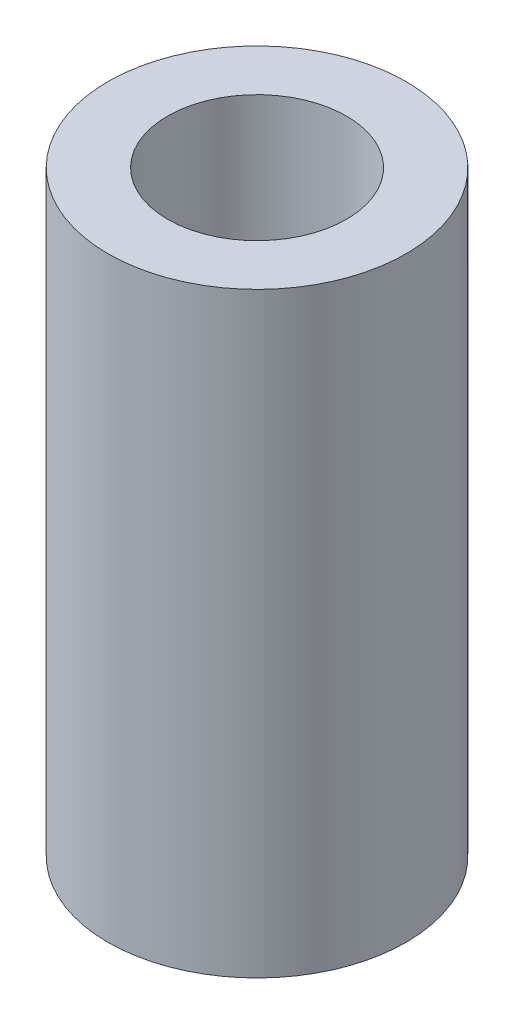
ISO-10303-21;
HEADER;
FILE_DESCRIPTION(('STEP AP214'),'2;1');
FILE_NAME('part.step','',(''),(''),'','','');
FILE_SCHEMA(('AUTOMOTIVE_DESIGN { 1 0 10303 214 1 1 1 1 }'));
ENDSEC;
DATA;
#1=APPLICATION_CONTEXT('core data for automotive mechanical design processes');
#2=APPLICATION_PROTOCOL_DEFINITION('international standard','automotive_design',2000,#1);
#3=PRODUCT_CONTEXT('',#1,'mechanical');
#4=PRODUCT('Part','Part','',(#3));
#5=PRODUCT_RELATED_PRODUCT_CATEGORY('part','',(#4));
#6=PRODUCT_DEFINITION_FORMATION('','',#4);
#7=PRODUCT_DEFINITION_CONTEXT('part definition',#1,'design');
#8=PRODUCT_DEFINITION('design','',#6,#7);
#9=PRODUCT_DEFINITION_SHAPE('','',#8);
#10=(LENGTH_UNIT() NAMED_UNIT(*) SI_UNIT(.MILLI.,.METRE.));
#11=(NAMED_UNIT(*) PLANE_ANGLE_UNIT() SI_UNIT($,.RADIAN.));
#12=(NAMED_UNIT(*) SI_UNIT($,.STERADIAN.) SOLID_ANGLE_UNIT());
#13=UNCERTAINTY_MEASURE_WITH_UNIT(LENGTH_MEASURE(1.E-05),#10,'distance_accuracy_value','');
#14=(GEOMETRIC_REPRESENTATION_CONTEXT(3) GLOBAL_UNCERTAINTY_ASSIGNED_CONTEXT((#13)) GLOBAL_UNIT_ASSIGNED_CONTEXT((#10,
#11,#12)) REPRESENTATION_CONTEXT('',''));
#15=CARTESIAN_POINT('',(0.,0.,0.));
#16=DIRECTION('',(0.,0.,1.));
#17=DIRECTION('',(1.,0.,0.));
#18=AXIS2_PLACEMENT_3D('',#15,#16,#17);
#19=CARTESIAN_POINT('',(0.,20.,0.));
#20=DIRECTION('',(0.,1.,0.));
#21=DIRECTION('',(0.,0.,1.));
#22=AXIS2_PLACEMENT_3D('',#19,#20,#21);
#23=PLANE('',#22);
#24=CARTESIAN_POINT('',(0.,20.,0.));
#25=DIRECTION('',(0.,1.,0.));
#26=DIRECTION('',(0.,0.,1.));
#27=AXIS2_PLACEMENT_3D('',#24,#25,#26);
#28=CIRCLE('',#27,5.);
#29=CARTESIAN_POINT('',(0.,20.,5.));
#30=VERTEX_POINT('',#29);
#31=EDGE_CURVE('E10',#30,#30,#28,.T.);
#32=ORIENTED_EDGE('',*,*,#31,.T.);
#33=EDGE_LOOP('',(#32));
#34=FACE_BOUND('',#33,.T.);
#35=CARTESIAN_POINT('',(0.,20.,0.));
#36=DIRECTION('',(0.,1.,0.));
#37=DIRECTION('',(0.,0.,1.));
#38=AXIS2_PLACEMENT_3D('',#35,#36,#37);
#39=CIRCLE('',#38,3.);
#40=CARTESIAN_POINT('',(0.,20.,3.));
#41=VERTEX_POINT('',#40);
#42=EDGE_CURVE('E54',#41,#41,#39,.T.);
#43=ORIENTED_EDGE('',*,*,#42,.F.);
#44=EDGE_LOOP('',(#43));
#45=FACE_BOUND('',#44,.T.);
#46=ADVANCED_FACE('F41',(#34,#45),#23,.T.);
#47=CARTESIAN_POINT('',(0.,0.,0.));
#48=DIRECTION('',(0.,1.,0.));
#49=DIRECTION('',(0.,0.,1.));
#50=AXIS2_PLACEMENT_3D('',#47,#48,#49);
#51=PLANE('',#50);
#52=CARTESIAN_POINT('',(0.,0.,0.));
#53=DIRECTION('',(0.,1.,0.));
#54=DIRECTION('',(0.,0.,1.));
#55=AXIS2_PLACEMENT_3D('',#52,#53,#54);
#56=CIRCLE('',#55,5.);
#57=CARTESIAN_POINT('',(0.,0.,5.));
#58=VERTEX_POINT('',#57);
#59=EDGE_CURVE('E45',#58,#58,#56,.T.);
#60=ORIENTED_EDGE('',*,*,#59,.F.);
#61=EDGE_LOOP('',(#60));
#62=FACE_BOUND('',#61,.T.);
#63=CARTESIAN_POINT('',(0.,0.,0.));
#64=DIRECTION('',(0.,1.,0.));
#65=DIRECTION('',(0.,0.,1.));
#66=AXIS2_PLACEMENT_3D('',#63,#64,#65);
#67=CIRCLE('',#66,3.);
#68=CARTESIAN_POINT('',(0.,0.,3.));
#69=VERTEX_POINT('',#68);
#70=EDGE_CURVE('E56',#69,#69,#67,.T.);
#71=ORIENTED_EDGE('',*,*,#70,.T.);
#72=EDGE_LOOP('',(#71));
#73=FACE_BOUND('',#72,.T.);
#74=ADVANCED_FACE('F68',(#62,#73),#51,.F.);
#75=CARTESIAN_POINT('',(0.,20.,0.));
#76=DIRECTION('',(0.,-1.,0.));
#77=DIRECTION('',(0.,0.,-1.));
#78=AXIS2_PLACEMENT_3D('',#75,#76,#77);
#79=CYLINDRICAL_SURFACE('',#78,5.);
#80=ORIENTED_EDGE('',*,*,#31,.F.);
#81=EDGE_LOOP('',(#80));
#82=FACE_BOUND('',#81,.T.);
#83=ORIENTED_EDGE('',*,*,#59,.T.);
#84=EDGE_LOOP('',(#83));
#85=FACE_BOUND('',#84,.T.);
#86=ADVANCED_FACE('F43',(#82,#85),#79,.T.);
#87=CARTESIAN_POINT('',(0.,20.,0.));
#88=DIRECTION('',(0.,-1.,0.));
#89=DIRECTION('',(0.,0.,-1.));
#90=AXIS2_PLACEMENT_3D('',#87,#88,#89);
#91=CYLINDRICAL_SURFACE('',#90,3.);
#92=ORIENTED_EDGE('',*,*,#42,.T.);
#93=EDGE_LOOP('',(#92));
#94=FACE_BOUND('',#93,.T.);
#95=ORIENTED_EDGE('',*,*,#70,.F.);
#96=EDGE_LOOP('',(#95));
#97=FACE_BOUND('',#96,.T.);
#98=ADVANCED_FACE('F64',(#94,#97),#91,.F.);
#99=CLOSED_SHELL('',(#46,#74,#86,#98));
#100=MANIFOLD_SOLID_BREP('B2',#99);
#101=ADVANCED_BREP_SHAPE_REPRESENTATION('',(#18,#100),#14);
#102=SHAPE_DEFINITION_REPRESENTATION(#9,#101);
ENDSEC;
END-ISO-10303-21;
